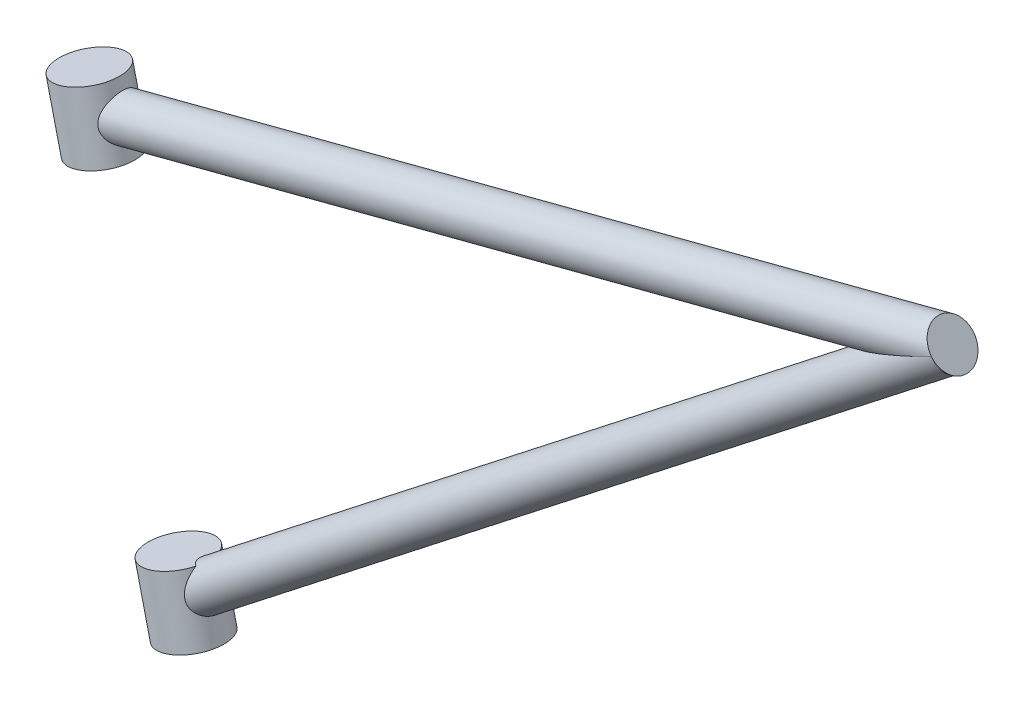
ISO-10303-21;
HEADER;
FILE_DESCRIPTION(('STEP AP214'),'2;1');
FILE_NAME('part.step','',(''),(''),'','','');
FILE_SCHEMA(('AUTOMOTIVE_DESIGN { 1 0 10303 214 1 1 1 1 }'));
ENDSEC;
DATA;
#1=APPLICATION_CONTEXT('core data for automotive mechanical design processes');
#2=APPLICATION_PROTOCOL_DEFINITION('international standard','automotive_design',2000,#1);
#3=PRODUCT_CONTEXT('',#1,'mechanical');
#4=PRODUCT('Part','Part','',(#3));
#5=PRODUCT_RELATED_PRODUCT_CATEGORY('part','',(#4));
#6=PRODUCT_DEFINITION_FORMATION('','',#4);
#7=PRODUCT_DEFINITION_CONTEXT('part definition',#1,'design');
#8=PRODUCT_DEFINITION('design','',#6,#7);
#9=PRODUCT_DEFINITION_SHAPE('','',#8);
#10=(LENGTH_UNIT() NAMED_UNIT(*) SI_UNIT(.MILLI.,.METRE.));
#11=(NAMED_UNIT(*) PLANE_ANGLE_UNIT() SI_UNIT($,.RADIAN.));
#12=(NAMED_UNIT(*) SI_UNIT($,.STERADIAN.) SOLID_ANGLE_UNIT());
#13=UNCERTAINTY_MEASURE_WITH_UNIT(LENGTH_MEASURE(1.E-05),#10,'distance_accuracy_value','');
#14=(GEOMETRIC_REPRESENTATION_CONTEXT(3) GLOBAL_UNCERTAINTY_ASSIGNED_CONTEXT((#13)) GLOBAL_UNIT_ASSIGNED_CONTEXT((#10,
#11,#12)) REPRESENTATION_CONTEXT('',''));
#15=CARTESIAN_POINT('',(0.,0.,0.));
#16=DIRECTION('',(0.,0.,1.));
#17=DIRECTION('',(1.,0.,0.));
#18=AXIS2_PLACEMENT_3D('',#15,#16,#17);
#19=CARTESIAN_POINT('',(215.,1151.6011,-53.649));
#20=DIRECTION('',(0.788508643665139,0.615015858971912,-0.00310033520835739));
#21=DIRECTION('',(-0.615018814783549,0.788512433295911,0.));
#22=AXIS2_PLACEMENT_3D('',#19,#20,#21);
#23=CYLINDRICAL_SURFACE('',#22,9.525);
#24=CARTESIAN_POINT('',(243.39562055654,1173.74893199642,-53.7606486710474));
#25=DIRECTION('',(-0.230684760062267,0.973028498209276,0.000288353283411398));
#26=DIRECTION('',(0.973022198051878,0.230684316193179,-0.00354236655039736));
#27=AXIS2_PLACEMENT_3D('',#24,#25,#26);
#28=ELLIPSE('',#27,22.8674930535986,9.525);
#29=CARTESIAN_POINT('',(224.320634321341,1169.225180437,-48.7995007985226));
#30=VERTEX_POINT('',#29);
#31=CARTESIAN_POINT('',(224.286262085042,1169.21993073521,-58.5827833271125));
#32=VERTEX_POINT('',#31);
#33=EDGE_CURVE('E80',#30,#32,#28,.F.);
#34=ORIENTED_EDGE('',*,*,#33,.F.);
#35=CARTESIAN_POINT('',(224.286262085042,1169.21993073521,-58.5827833271125));
#36=CARTESIAN_POINT('',(224.259857325888,1169.08518369756,-58.7334222265341));
#37=CARTESIAN_POINT('',(224.233039669883,1168.94604086328,-58.8799868131545));
#38=CARTESIAN_POINT('',(224.178991820654,1168.65996638962,-59.1650957687113));
#39=CARTESIAN_POINT('',(224.151761828018,1168.51303845566,-59.3036438886452));
#40=CARTESIAN_POINT('',(224.097330416037,1168.2125631291,-59.5727254876107));
#41=CARTESIAN_POINT('',(224.070129045662,1168.05902930883,-59.7032741781378));
#42=CARTESIAN_POINT('',(224.01607745269,1167.74582344913,-59.9568762347867));
#43=CARTESIAN_POINT('',(223.989227276873,1167.5861506029,-60.0799286101978));
#44=CARTESIAN_POINT('',(223.909708784618,1167.09862159596,-60.4383869338368));
#45=CARTESIAN_POINT('',(223.858116884653,1166.76249561412,-60.6628811966612));
#46=CARTESIAN_POINT('',(223.760795592024,1166.07242209011,-61.0842061784766));
#47=CARTESIAN_POINT('',(223.715069350101,1165.718465111,-61.2810220354276));
#48=CARTESIAN_POINT('',(223.636664786251,1165.0304754153,-61.6302543273577));
#49=CARTESIAN_POINT('',(223.603156724985,1164.69777584187,-61.7851169950369));
#50=CARTESIAN_POINT('',(223.546313161637,1164.02225456936,-62.0730099883752));
#51=CARTESIAN_POINT('',(223.522976398826,1163.67943413039,-62.2060430185345));
#52=CARTESIAN_POINT('',(223.489676812072,1162.9854248798,-62.4497650608225));
#53=CARTESIAN_POINT('',(223.479707198136,1162.63424040913,-62.5604653927971));
#54=CARTESIAN_POINT('',(223.476895189122,1161.92538048244,-62.7582826238399));
#55=CARTESIAN_POINT('',(223.484046705598,1161.56770737875,-62.8454078941737));
#56=CARTESIAN_POINT('',(223.526129800851,1160.72354013421,-63.019632003482));
#57=CARTESIAN_POINT('',(223.569782905443,1160.23511607562,-63.0963815878199));
#58=CARTESIAN_POINT('',(223.673039754559,1159.50421169317,-63.1703509628201));
#59=CARTESIAN_POINT('',(223.713721858204,1159.26100004498,-63.1881497714082));
#60=CARTESIAN_POINT('',(223.808925405596,1158.77656784518,-63.208784261346));
#61=CARTESIAN_POINT('',(223.863446913944,1158.53534730287,-63.21161987285));
#62=CARTESIAN_POINT('',(223.987999226804,1158.0538387664,-63.2009379730411));
#63=CARTESIAN_POINT('',(224.058226605981,1157.81360581606,-63.1872025274816));
#64=CARTESIAN_POINT('',(224.213948087072,1157.33984142985,-63.1417799374408));
#65=CARTESIAN_POINT('',(224.299441506856,1157.10630969509,-63.1100935949197));
#66=CARTESIAN_POINT('',(224.484918597031,1156.64861619958,-63.0279072957908));
#67=CARTESIAN_POINT('',(224.584894816063,1156.4244496964,-62.97741699291));
#68=CARTESIAN_POINT('',(224.797681142944,1155.98766669081,-62.8572366265394));
#69=CARTESIAN_POINT('',(224.910489960448,1155.77504903031,-62.7875484924329));
#70=CARTESIAN_POINT('',(225.128165273432,1155.39502394416,-62.6414190706142));
#71=CARTESIAN_POINT('',(225.231556877416,1155.22571379616,-62.5676942871559));
#72=CARTESIAN_POINT('',(225.44401194002,1154.8971588129,-62.406965429258));
#73=CARTESIAN_POINT('',(225.553077604184,1154.73791794574,-62.319956165241));
#74=CARTESIAN_POINT('',(225.775019094641,1154.42987011107,-62.1331560767408));
#75=CARTESIAN_POINT('',(225.887896113201,1154.28106645417,-62.0333612248764));
#76=CARTESIAN_POINT('',(226.115608918504,1153.99398465869,-61.8215969051118));
#77=CARTESIAN_POINT('',(226.230444940643,1153.85570779608,-61.7096259653097));
#78=CARTESIAN_POINT('',(226.46640898153,1153.58252515966,-61.4679271119184));
#79=CARTESIAN_POINT('',(226.587548762974,1153.44818382824,-61.337573472335));
#80=CARTESIAN_POINT('',(226.82820128942,1153.19075081337,-61.0648374828117));
#81=CARTESIAN_POINT('',(226.947714016948,1153.06765925064,-60.9224550038083));
#82=CARTESIAN_POINT('',(227.183456996661,1152.83235048838,-60.6263657424205));
#83=CARTESIAN_POINT('',(227.29968645648,1152.72013589822,-60.4726562581964));
#84=CARTESIAN_POINT('',(227.527315519424,1152.50626944914,-60.1546736029061));
#85=CARTESIAN_POINT('',(227.63871480492,1152.40461828425,-59.9903997388923));
#86=CARTESIAN_POINT('',(227.873123418797,1152.19569467397,-59.6241829279834));
#87=CARTESIAN_POINT('',(227.995029525822,1152.09024665705,-59.4204877809454));
#88=CARTESIAN_POINT('',(228.228473609432,1151.89287255824,-59.000949780285));
#89=CARTESIAN_POINT('',(228.340010636346,1151.80094771444,-58.7851058168927));
#90=CARTESIAN_POINT('',(228.551008201797,1151.63032006214,-58.3424633826018));
#91=CARTESIAN_POINT('',(228.650465034046,1151.55162130866,-58.1156615794439));
#92=CARTESIAN_POINT('',(228.83572510005,1151.40730238531,-57.6525195071222));
#93=CARTESIAN_POINT('',(228.92152837014,1151.34168218063,-57.416179263345));
#94=CARTESIAN_POINT('',(229.081485830094,1151.22090349209,-56.9251846859305));
#95=CARTESIAN_POINT('',(229.154989456591,1151.16630857725,-56.6701789396034));
#96=CARTESIAN_POINT('',(229.284460401839,1151.07117985988,-56.1531731303483));
#97=CARTESIAN_POINT('',(229.340427068882,1151.0306465799,-55.8911728078801));
#98=CARTESIAN_POINT('',(229.433846047649,1150.963646173,-55.3621714159013));
#99=CARTESIAN_POINT('',(229.471302148862,1150.93717616695,-55.0951713815594));
#100=CARTESIAN_POINT('',(229.527062363931,1150.89830263798,-54.5581687493097));
#101=CARTESIAN_POINT('',(229.545367263428,1150.88589853803,-54.2881662750304));
#102=CARTESIAN_POINT('',(229.562199853024,1150.87535932399,-53.7571259945295));
#103=CARTESIAN_POINT('',(229.561423639708,1150.87672092083,-53.4961198833487));
#104=CARTESIAN_POINT('',(229.54182225614,1150.89250809807,-52.9751874948947));
#105=CARTESIAN_POINT('',(229.522997505866,1150.9069333745,-52.7152611926364));
#106=CARTESIAN_POINT('',(229.467621648065,1150.94883442944,-52.198393218211));
#107=CARTESIAN_POINT('',(229.431072078148,1150.97630907593,-51.9414512891322));
#108=CARTESIAN_POINT('',(229.340854163361,1151.04429691626,-51.4323457186929));
#109=CARTESIAN_POINT('',(229.287185724139,1151.08481018195,-51.1801821036765));
#110=CARTESIAN_POINT('',(229.164114514175,1151.17849155133,-50.684408224491));
#111=CARTESIAN_POINT('',(229.094844818259,1151.23155280478,-50.4407446602848));
#112=CARTESIAN_POINT('',(228.941420982296,1151.35054264559,-49.9613837856289));
#113=CARTESIAN_POINT('',(228.857266934708,1151.41647115302,-49.7256864257047));
#114=CARTESIAN_POINT('',(228.675340927335,1151.56132618532,-49.2636028445119));
#115=CARTESIAN_POINT('',(228.577562843186,1151.64025855868,-49.0372208703685));
#116=CARTESIAN_POINT('',(228.369929673435,1151.81127984121,-48.5952204581985));
#117=CARTESIAN_POINT('',(228.260074308572,1151.90336905461,-48.379602269228));
#118=CARTESIAN_POINT('',(228.025641852722,1152.10472360081,-47.9524464985806));
#119=CARTESIAN_POINT('',(227.900664970458,1152.2145070493,-47.7413721247286));
#120=CARTESIAN_POINT('',(227.641692170489,1152.44898572412,-47.3334870610304));
#121=CARTESIAN_POINT('',(227.507695538429,1152.57368213214,-47.1366775035155));
#122=CARTESIAN_POINT('',(227.233168220124,1152.83848396559,-46.7586981138108));
#123=CARTESIAN_POINT('',(227.092639522964,1152.97858471773,-46.5775235679732));
#124=CARTESIAN_POINT('',(226.807776868606,1153.27482164288,-46.2320765009033));
#125=CARTESIAN_POINT('',(226.663443626362,1153.43095481881,-46.0678008320655));
#126=CARTESIAN_POINT('',(226.398381649131,1153.73220035553,-45.7835229472519));
#127=CARTESIAN_POINT('',(226.277756793015,1153.87476454738,-45.6607174563726));
#128=CARTESIAN_POINT('',(226.038026162807,1154.17157832639,-45.4284949783267));
#129=CARTESIAN_POINT('',(225.918920107725,1154.3258257143,-45.3190754814821));
#130=CARTESIAN_POINT('',(225.68447363856,1154.64583511665,-45.1144618249629));
#131=CARTESIAN_POINT('',(225.56912892202,1154.81158324434,-45.0192509321473));
#132=CARTESIAN_POINT('',(225.344231202539,1155.15444321128,-44.8435327087651));
#133=CARTESIAN_POINT('',(225.234678188904,1155.33155502955,-44.7630253510501));
#134=CARTESIAN_POINT('',(225.022918953883,1155.69734784393,-44.6167956848934));
#135=CARTESIAN_POINT('',(224.920752853279,1155.8860830084,-44.5511505102988));
#136=CARTESIAN_POINT('',(224.726236552822,1156.2731161268,-44.4353515205439));
#137=CARTESIAN_POINT('',(224.633885981681,1156.47141371862,-44.3851971192857));
#138=CARTESIAN_POINT('',(224.460378084522,1156.87601236501,-44.3002130778941));
#139=CARTESIAN_POINT('',(224.379220459273,1157.08231320545,-44.2653830280258));
#140=CARTESIAN_POINT('',(224.228871364813,1157.50114234092,-44.2105340427636));
#141=CARTESIAN_POINT('',(224.159681129355,1157.71367127539,-44.1905166337503));
#142=CARTESIAN_POINT('',(224.024758252432,1158.17268394055,-44.1627261198933));
#143=CARTESIAN_POINT('',(223.960810831434,1158.41981650712,-44.1570163817677));
#144=CARTESIAN_POINT('',(223.84806207577,1158.9173015926,-44.1623562048332));
#145=CARTESIAN_POINT('',(223.799263220286,1159.16765463159,-44.173408507524));
#146=CARTESIAN_POINT('',(223.715527415159,1159.6701047542,-44.2108590866441));
#147=CARTESIAN_POINT('',(223.680624287529,1159.92220459189,-44.2372944252073));
#148=CARTESIAN_POINT('',(223.623333552202,1160.42599160862,-44.3041988677007));
#149=CARTESIAN_POINT('',(223.600950420562,1160.67767860805,-44.3446729823029));
#150=CARTESIAN_POINT('',(223.558780297688,1161.30287687313,-44.4616078378177));
#151=CARTESIAN_POINT('',(223.545694317176,1161.67537289618,-44.5459758038928));
#152=CARTESIAN_POINT('',(223.538808081783,1162.41371197458,-44.7406100397313));
#153=CARTESIAN_POINT('',(223.545016437151,1162.77955198637,-44.8508878516685));
#154=CARTESIAN_POINT('',(223.572366659079,1163.50269049958,-45.0957872402616));
#155=CARTESIAN_POINT('',(223.593520155094,1163.85998212515,-45.230427713817));
#156=CARTESIAN_POINT('',(223.647104845075,1164.56390081036,-45.523302583792));
#157=CARTESIAN_POINT('',(223.679537190931,1164.9105267768,-45.6815393891229));
#158=CARTESIAN_POINT('',(223.756030086726,1165.62330036858,-46.0377397506442));
#159=CARTESIAN_POINT('',(223.800900330001,1165.98819350736,-46.238045206054));
#160=CARTESIAN_POINT('',(223.896881081983,1166.69941202241,-46.6677952406542));
#161=CARTESIAN_POINT('',(223.947988032294,1167.04574782584,-46.897223206772));
#162=CARTESIAN_POINT('',(224.026816912979,1167.5476009186,-47.2640278767862));
#163=CARTESIAN_POINT('',(224.053423020627,1167.7117661915,-47.3899166807251));
#164=CARTESIAN_POINT('',(224.106979674164,1168.03368651719,-47.6495584858503));
#165=CARTESIAN_POINT('',(224.133930170897,1168.19144247162,-47.7833103743365));
#166=CARTESIAN_POINT('',(224.187824471542,1168.5000637803,-48.0591988432474));
#167=CARTESIAN_POINT('',(224.214768147409,1168.65091427743,-48.2013521213038));
#168=CARTESIAN_POINT('',(224.268174197067,1168.94444836238,-48.494074583859));
#169=CARTESIAN_POINT('',(224.294636321789,1169.08712780152,-48.6446479681439));
#170=CARTESIAN_POINT('',(224.320634321341,1169.225180437,-48.7995007985225));
#171=B_SPLINE_CURVE_WITH_KNOTS('',3,(#35,#36,#37,#38,#39,#40,#41,#42,#43,#44,#45,#46,#47,#48,
#49,#50,#51,#52,#53,#54,#55,#56,#57,#58,#59,#60,#61,#62,#63,#64,#65,#66,#67,#68,#69,#70,#71,#72,
#73,#74,#75,#76,#77,#78,#79,#80,#81,#82,#83,#84,#85,#86,#87,#88,#89,#90,#91,#92,#93,#94,#95,#96,
#97,#98,#99,#100,#101,#102,#103,#104,#105,#106,#107,#108,#109,#110,#111,#112,#113,#114,#115,
#116,#117,#118,#119,#120,#121,#122,#123,#124,#125,#126,#127,#128,#129,#130,#131,#132,#133,#134,
#135,#136,#137,#138,#139,#140,#141,#142,#143,#144,#145,#146,#147,#148,#149,#150,#151,#152,#153,
#154,#155,#156,#157,#158,#159,#160,#161,#162,#163,#164,#165,#166,#167,#168,#169,#170),
.UNSPECIFIED.,.F.,.F.,(4,2,2,2,2,2,2,2,2,2,2,2,2,2,2,2,2,2,2,2,2,2,2,2,2,2,2,2,2,2,2,2,2,2,2,2,
2,2,2,2,2,2,2,2,2,2,2,2,2,2,2,2,2,2,2,2,2,2,2,2,2,2,2,2,2,2,2,4),(0.,0.611321113095535,
1.22235382943916,1.83218605530848,2.44209870234858,3.66289333627033,4.88434099855862,
5.98894252437597,7.09340709627896,8.19731043031264,9.30082126350922,10.7844934193151,
11.5255072719035,12.2665245834173,13.0173945439189,13.7682309617921,14.5186824394657,
15.2690585242179,15.9032452299519,16.5376803173909,17.172315741574,17.8070279688859,
18.4752867183988,19.1435526389087,19.8119784806391,20.48044821112,21.2588433186672,
22.0373096468024,22.8160142137429,23.5947167082835,24.4065344178049,25.2183822925518,
26.030063896594,26.8417122016533,27.6237962912566,28.4058621827752,29.1878602430734,
29.9698626134922,30.7454316380738,31.5209958450605,32.296909820138,33.0728417402577,
33.8781372588609,34.6834966314204,35.4886123495505,36.2935778332748,36.963445893815,
37.6331881707954,38.3021353757178,38.971081345498,39.6434233396011,40.3157398923394,
40.9880384679269,41.6604063114264,42.4252747618274,43.19026832305,43.9571126486434,
44.7242309558053,45.8689446439783,47.0141692429464,48.1602859732016,49.3065197888626,
50.561168015951,51.8151037127786,52.4406454213909,53.0660988220636,53.6928400783572,
54.3198967787742),.UNSPECIFIED.);
#172=EDGE_CURVE('E86',#32,#30,#171,.T.);
#173=ORIENTED_EDGE('',*,*,#172,.F.);
#174=EDGE_LOOP('',(#34,#173));
#175=FACE_BOUND('',#174,.T.);
#176=CARTESIAN_POINT('',(558.599999999999,1419.6,-55.));
#177=DIRECTION('',(0.897008226583714,0.442000857679935,-0.00338869463695132));
#178=DIRECTION('',(-0.441999884452041,0.897014466927656,0.00107157215105032));
#179=AXIS2_PLACEMENT_3D('',#176,#177,#178);
#180=ELLIPSE('',#179,9.72785711197768,9.525);
#181=CARTESIAN_POINT('',(558.633464600869,1419.60511105407,-45.4750601577955));
#182=VERTEX_POINT('',#181);
#183=CARTESIAN_POINT('',(558.566535399132,1419.59488894593,-64.5249398422045));
#184=VERTEX_POINT('',#183);
#185=EDGE_CURVE('E93',#182,#184,#180,.T.);
#186=ORIENTED_EDGE('',*,*,#185,.F.);
#187=CARTESIAN_POINT('',(558.599999999999,1419.6,-55.));
#188=DIRECTION('',(-0.441999884452041,0.897014466927656,0.00107157215105032));
#189=DIRECTION('',(0.897008226583714,0.442000857679935,-0.00338869463695132));
#190=AXIS2_PLACEMENT_3D('',#187,#188,#189);
#191=ELLIPSE('',#190,46.8855974220386,9.525);
#192=EDGE_CURVE('E119',#184,#182,#191,.T.);
#193=ORIENTED_EDGE('',*,*,#192,.F.);
#194=EDGE_LOOP('',(#186,#193));
#195=FACE_BOUND('',#194,.T.);
#196=ADVANCED_FACE('F67',(#175,#195),#23,.T.);
#197=CARTESIAN_POINT('',(175.,1320.3211,-53.599));
#198=DIRECTION('',(0.968096795715719,0.250551577091192,-0.00353572369863849));
#199=DIRECTION('',(-0.250553143221362,0.968102847027058,0.));
#200=AXIS2_PLACEMENT_3D('',#197,#198,#199);
#201=CYLINDRICAL_SURFACE('',#200,9.525);
#202=CARTESIAN_POINT('',(186.358449875382,1333.09959285992,-53.6491999503622));
#203=CARTESIAN_POINT('',(186.357581805738,1333.09936924817,-53.8860568586097));
#204=CARTESIAN_POINT('',(186.352921387654,1333.08902414914,-54.1228779562829));
#205=CARTESIAN_POINT('',(186.336141928165,1333.04828094335,-54.5945068523737));
#206=CARTESIAN_POINT('',(186.324023352325,1333.01788408828,-54.8293147755331));
#207=CARTESIAN_POINT('',(186.292666114835,1332.93755309473,-55.2951172089378));
#208=CARTESIAN_POINT('',(186.273425955695,1332.88761484706,-55.526110906468));
#209=CARTESIAN_POINT('',(186.228361236772,1332.76901114286,-55.9825714129173));
#210=CARTESIAN_POINT('',(186.202536484875,1332.70034513992,-56.2080380603657));
#211=CARTESIAN_POINT('',(186.145145325905,1332.54570964981,-56.6508525754505));
#212=CARTESIAN_POINT('',(186.113609333163,1332.45983157607,-56.8682364289368));
#213=CARTESIAN_POINT('',(186.045493710991,1332.27164581024,-57.2950339080024));
#214=CARTESIAN_POINT('',(186.00891210623,1332.16933168093,-57.5044443708686));
#215=CARTESIAN_POINT('',(185.931611677371,1331.94951339829,-57.9142212421292));
#216=CARTESIAN_POINT('',(185.890894265745,1331.83201442722,-58.1145907046935));
#217=CARTESIAN_POINT('',(185.806239384516,1331.58291939138,-58.5057339536995));
#218=CARTESIAN_POINT('',(185.762300721704,1331.45131809444,-58.6965041398218));
#219=CARTESIAN_POINT('',(185.668207883311,1331.16291156617,-59.0843166682633));
#220=CARTESIAN_POINT('',(185.617847978309,1331.00490627344,-59.2804163396614));
#221=CARTESIAN_POINT('',(185.515822385934,1330.67483630273,-59.6600487913169));
#222=CARTESIAN_POINT('',(185.464156548356,1330.50277000237,-59.8435801169037));
#223=CARTESIAN_POINT('',(185.360844773911,1330.14549946665,-60.197931970596));
#224=CARTESIAN_POINT('',(185.309198975563,1329.96027646621,-60.3687336016283));
#225=CARTESIAN_POINT('',(185.207513427391,1329.57802118981,-60.6969344393526));
#226=CARTESIAN_POINT('',(185.157473194482,1329.38099251812,-60.8543377013953));
#227=CARTESIAN_POINT('',(185.052074145416,1328.94040065302,-61.1819144564466));
#228=CARTESIAN_POINT('',(184.997324603338,1328.69474183357,-61.3494760918669));
#229=CARTESIAN_POINT('',(184.895124717704,1328.18960759521,-61.6650101261469));
#230=CARTESIAN_POINT('',(184.847676144492,1327.93012884571,-61.8129777726354));
#231=CARTESIAN_POINT('',(184.763424911842,1327.39915978738,-62.0881314357339));
#232=CARTESIAN_POINT('',(184.726607184471,1327.12768711447,-62.2153467537986));
#233=CARTESIAN_POINT('',(184.667181423721,1326.57392268385,-62.4479771640655));
#234=CARTESIAN_POINT('',(184.64457385024,1326.29163057629,-62.5533915506263));
#235=CARTESIAN_POINT('',(184.621485123181,1325.80286250974,-62.7131545304106));
#236=CARTESIAN_POINT('',(184.616451088553,1325.59851542322,-62.7734026114947));
#237=CARTESIAN_POINT('',(184.616781271352,1325.18667623677,-62.88151769934));
#238=CARTESIAN_POINT('',(184.622138831213,1324.9791862349,-62.9293926109313));
#239=CARTESIAN_POINT('',(184.644451588589,1324.56250380516,-63.0120817315778));
#240=CARTESIAN_POINT('',(184.661391083203,1324.35331406078,-63.0469135257822));
#241=CARTESIAN_POINT('',(184.707787702243,1323.93447859591,-63.1030109629274));
#242=CARTESIAN_POINT('',(184.737244818194,1323.72483287572,-63.1242766150539));
#243=CARTESIAN_POINT('',(184.809376765781,1323.30562257425,-63.1528835624823));
#244=CARTESIAN_POINT('',(184.852125615775,1323.09606519691,-63.1601452000057));
#245=CARTESIAN_POINT('',(184.950720167319,1322.68004735338,-63.1603045370767));
#246=CARTESIAN_POINT('',(185.006565827107,1322.47358687733,-63.153202282425));
#247=CARTESIAN_POINT('',(185.130725059478,1322.06534813991,-63.124715285959));
#248=CARTESIAN_POINT('',(185.1990452174,1321.86357241537,-63.1033229844382));
#249=CARTESIAN_POINT('',(185.346956732024,1321.46622562205,-63.0466041357607));
#250=CARTESIAN_POINT('',(185.426548259071,1321.27065464711,-63.0112773779979));
#251=CARTESIAN_POINT('',(185.589795585038,1320.89964521409,-62.9300597690826));
#252=CARTESIAN_POINT('',(185.672819955293,1320.72373655515,-62.8850372001994));
#253=CARTESIAN_POINT('',(185.845969463324,1320.37871903053,-62.7838642623975));
#254=CARTESIAN_POINT('',(185.93609722828,1320.20961271594,-62.7277097646059));
#255=CARTESIAN_POINT('',(186.215068504544,1319.71289126492,-62.54329813677));
#256=CARTESIAN_POINT('',(186.412512692632,1319.39584564143,-62.3990866125953));
#257=CARTESIAN_POINT('',(186.765826290244,1318.87052979932,-62.1152121318951));
#258=CARTESIAN_POINT('',(186.919011236763,1318.65554568582,-61.9842838873622));
#259=CARTESIAN_POINT('',(187.228263744508,1318.24098753079,-61.7026174616929));
#260=CARTESIAN_POINT('',(187.384332336723,1318.04141913833,-61.5518720727678));
#261=CARTESIAN_POINT('',(187.696163578207,1317.65729232131,-61.2313067808288));
#262=CARTESIAN_POINT('',(187.851925349499,1317.47275820803,-61.061457000686));
#263=CARTESIAN_POINT('',(188.15984241871,1317.1189504319,-60.7036160437416));
#264=CARTESIAN_POINT('',(188.311998122509,1316.94967504553,-60.5156269208007));
#265=CARTESIAN_POINT('',(188.611258175865,1316.62499302276,-60.1202846008485));
#266=CARTESIAN_POINT('',(188.758302080137,1316.46973067059,-59.9127669583086));
#267=CARTESIAN_POINT('',(189.043006391365,1316.17528054179,-59.4805307218162));
#268=CARTESIAN_POINT('',(189.180666052356,1316.03609404243,-59.2558107634381));
#269=CARTESIAN_POINT('',(189.443583326935,1315.77472067425,-58.7903989265441));
#270=CARTESIAN_POINT('',(189.56886071874,1315.65250656462,-58.5497335795888));
#271=CARTESIAN_POINT('',(189.804496573069,1315.42576218832,-58.0532590524574));
#272=CARTESIAN_POINT('',(189.914858982971,1315.32122724086,-57.7974539050311));
#273=CARTESIAN_POINT('',(190.097360437763,1315.1502664167,-57.3256531481095));
#274=CARTESIAN_POINT('',(190.172709407114,1315.08041316403,-57.1121321695133));
#275=CARTESIAN_POINT('',(190.310988394956,1314.9531980356,-56.6774962166102));
#276=CARTESIAN_POINT('',(190.373920711047,1314.89583384865,-56.4563826561554));
#277=CARTESIAN_POINT('',(190.486204383596,1314.79417399333,-56.0078915180193));
#278=CARTESIAN_POINT('',(190.535561910641,1314.74987238654,-55.7805168382876));
#279=CARTESIAN_POINT('',(190.619775648931,1314.67479620972,-55.3208802448295));
#280=CARTESIAN_POINT('',(190.654631569934,1314.64402191043,-55.088618233383));
#281=CARTESIAN_POINT('',(190.709219506578,1314.59629971111,-54.620094518065));
#282=CARTESIAN_POINT('',(190.728899436158,1314.57939941584,-54.3838218589998));
#283=CARTESIAN_POINT('',(190.752522070303,1314.55982499237,-53.9098999993929));
#284=CARTESIAN_POINT('',(190.756464777017,1314.55715086223,-53.6722507990392));
#285=CARTESIAN_POINT('',(190.74853796159,1314.56606538467,-53.1974797402003));
#286=CARTESIAN_POINT('',(190.736667952536,1314.57765447645,-52.9603578981791));
#287=CARTESIAN_POINT('',(190.697385799487,1314.61494272464,-52.4885342998953));
#288=CARTESIAN_POINT('',(190.669974064182,1314.64064151002,-52.2538324801602));
#289=CARTESIAN_POINT('',(190.60210702458,1314.70404480997,-51.8012890673313));
#290=CARTESIAN_POINT('',(190.562442949291,1314.74101966432,-51.5832251363854));
#291=CARTESIAN_POINT('',(190.470468361588,1314.82691729862,-51.1521053557148));
#292=CARTESIAN_POINT('',(190.418153471505,1314.87584421449,-50.9390512676522));
#293=CARTESIAN_POINT('',(190.301804769865,1314.98516246825,-50.5192623113846));
#294=CARTESIAN_POINT('',(190.23777433869,1315.04555049935,-50.3125256403926));
#295=CARTESIAN_POINT('',(190.098988703125,1315.17732773214,-49.9062127733766));
#296=CARTESIAN_POINT('',(190.024229563262,1315.24872097144,-49.7066392386435));
#297=CARTESIAN_POINT('',(189.859092695624,1315.40779858859,-49.3007311374482));
#298=CARTESIAN_POINT('',(189.767961451142,1315.49630657265,-49.0950262173476));
#299=CARTESIAN_POINT('',(189.575995491525,1315.68492732757,-48.6936144814056));
#300=CARTESIAN_POINT('',(189.475156675702,1315.78504500631,-48.4979119446988));
#301=CARTESIAN_POINT('',(189.26523354595,1315.99640745987,-48.1171153382557));
#302=CARTESIAN_POINT('',(189.156145774544,1316.10765690685,-47.9320257746452));
#303=CARTESIAN_POINT('',(188.931243948177,1316.34086214408,-47.5730060039958));
#304=CARTESIAN_POINT('',(188.815429173267,1316.462819081,-47.3990769956121));
#305=CARTESIAN_POINT('',(188.559595552326,1316.73754646288,-47.0358277650413));
#306=CARTESIAN_POINT('',(188.418671770066,1316.89212314421,-46.8485064696081));
#307=CARTESIAN_POINT('',(188.13219334881,1317.21509488208,-46.4899780943311));
#308=CARTESIAN_POINT('',(187.98663799616,1317.38349207451,-46.3187735140675));
#309=CARTESIAN_POINT('',(187.69335940703,1317.73417382321,-45.993015875013));
#310=CARTESIAN_POINT('',(187.545635360469,1317.9164636812,-45.8384692281109));
#311=CARTESIAN_POINT('',(187.250896297353,1318.29489878848,-45.546893630638));
#312=CARTESIAN_POINT('',(187.10388116203,1318.49104162417,-45.4098616401601));
#313=CARTESIAN_POINT('',(186.711848019207,1319.03983337127,-45.0646876401787));
#314=CARTESIAN_POINT('',(186.470069582025,1319.40614092922,-44.8736949049768));
#315=CARTESIAN_POINT('',(186.128594725721,1319.98579136724,-44.6318338491623));
#316=CARTESIAN_POINT('',(186.0183486621,1320.18393967721,-44.5586753759218));
#317=CARTESIAN_POINT('',(185.807142470588,1320.59017598142,-44.428001535468));
#318=CARTESIAN_POINT('',(185.706180581936,1320.79826207953,-44.3704831980091));
#319=CARTESIAN_POINT('',(185.530685811562,1321.19053640945,-44.2796599099045));
#320=CARTESIAN_POINT('',(185.454481769683,1321.37343182466,-44.2439841214191));
#321=CARTESIAN_POINT('',(185.311718069508,1321.74487735506,-44.1849503604514));
#322=CARTESIAN_POINT('',(185.245156582567,1321.93342638987,-44.1615900502011));
#323=CARTESIAN_POINT('',(185.12276253222,1322.31497282549,-44.1275367958688));
#324=CARTESIAN_POINT('',(185.066923258771,1322.507967359,-44.11683590764));
#325=CARTESIAN_POINT('',(184.966599723133,1322.89717359928,-44.1082177379753));
#326=CARTESIAN_POINT('',(184.92211571741,1323.09338537861,-44.1103007452468));
#327=CARTESIAN_POINT('',(184.844776252853,1323.48730711267,-44.1271574854349));
#328=CARTESIAN_POINT('',(184.811907648939,1323.68501511354,-44.1419168073075));
#329=CARTESIAN_POINT('',(184.757495126135,1324.08065900116,-44.1838093238672));
#330=CARTESIAN_POINT('',(184.735951123118,1324.27859488622,-44.2109424266309));
#331=CARTESIAN_POINT('',(184.70354236532,1324.67351258009,-44.2771572319573));
#332=CARTESIAN_POINT('',(184.692687677242,1324.87049331603,-44.3162501524127));
#333=CARTESIAN_POINT('',(184.68076744278,1325.26222490871,-44.4058469426852));
#334=CARTESIAN_POINT('',(184.679707454993,1325.45697443661,-44.4563572753527));
#335=CARTESIAN_POINT('',(184.687432459972,1325.90937755942,-44.5873846734801));
#336=CARTESIAN_POINT('',(184.699715432589,1326.16571891247,-44.6722531138744));
#337=CARTESIAN_POINT('',(184.737184333095,1326.67067267163,-44.8602330441933));
#338=CARTESIAN_POINT('',(184.762375216181,1326.91928207063,-44.9633515301394));
#339=CARTESIAN_POINT('',(184.822955696175,1327.40770496011,-45.1868747568261));
#340=CARTESIAN_POINT('',(184.858359441897,1327.64750572402,-45.3073033619292));
#341=CARTESIAN_POINT('',(184.936812023289,1328.11684032839,-45.564459999739));
#342=CARTESIAN_POINT('',(184.979860231173,1328.34637501001,-45.701186693695));
#343=CARTESIAN_POINT('',(185.072300087104,1328.79902176096,-45.9933844218682));
#344=CARTESIAN_POINT('',(185.121807668162,1329.02189163759,-46.1491936767173));
#345=CARTESIAN_POINT('',(185.22424037892,1329.45488860031,-46.4766106031539));
#346=CARTESIAN_POINT('',(185.277165647241,1329.66501516887,-46.6482189156703));
#347=CARTESIAN_POINT('',(185.384406200937,1330.07117091901,-47.0066185949464));
#348=CARTESIAN_POINT('',(185.438720168277,1330.26721284094,-47.1933959061554));
#349=CARTESIAN_POINT('',(185.546984847139,1330.64416011972,-47.5819021627384));
#350=CARTESIAN_POINT('',(185.600935430507,1330.82506036979,-47.7836361095697));
#351=CARTESIAN_POINT('',(185.703609981598,1331.15991960414,-48.1890961845373));
#352=CARTESIAN_POINT('',(185.752454295458,1331.31483948368,-48.391997545968));
#353=CARTESIAN_POINT('',(185.84691275443,1331.60840694889,-48.8098351485464));
#354=CARTESIAN_POINT('',(185.8925285236,1331.74706273932,-49.0247652400169));
#355=CARTESIAN_POINT('',(185.979264145823,1332.00667430089,-49.4659537140339));
#356=CARTESIAN_POINT('',(186.020384057609,1332.12763030326,-49.6922119485354));
#357=CARTESIAN_POINT('',(186.096912393674,1332.35026974381,-50.1549758014051));
#358=CARTESIAN_POINT('',(186.132320921415,1332.45195353111,-50.3914812340472));
#359=CARTESIAN_POINT('',(186.19609848046,1332.63387559637,-50.8716561480927));
#360=CARTESIAN_POINT('',(186.22451430816,1332.71425673083,-51.1152650812674));
#361=CARTESIAN_POINT('',(186.273687588887,1332.85311224309,-51.6094271370383));
#362=CARTESIAN_POINT('',(186.294445112961,1332.91158682411,-51.8599801951905));
#363=CARTESIAN_POINT('',(186.327567958921,1333.00548903654,-52.3657615985444));
#364=CARTESIAN_POINT('',(186.339938743977,1333.04093167046,-52.620986788781));
#365=CARTESIAN_POINT('',(186.355851439896,1333.08810419856,-53.1338888977806));
#366=CARTESIAN_POINT('',(186.359394093362,1333.09983608721,-53.3915656084966));
#367=CARTESIAN_POINT('',(186.358449875382,1333.09959285992,-53.6491999503622));
#368=B_SPLINE_CURVE_WITH_KNOTS('',3,(#202,#203,#204,#205,#206,#207,#208,#209,#210,#211,#212,
#213,#214,#215,#216,#217,#218,#219,#220,#221,#222,#223,#224,#225,#226,#227,#228,#229,#230,#231,
#232,#233,#234,#235,#236,#237,#238,#239,#240,#241,#242,#243,#244,#245,#246,#247,#248,#249,#250,
#251,#252,#253,#254,#255,#256,#257,#258,#259,#260,#261,#262,#263,#264,#265,#266,#267,#268,#269,
#270,#271,#272,#273,#274,#275,#276,#277,#278,#279,#280,#281,#282,#283,#284,#285,#286,#287,#288,
#289,#290,#291,#292,#293,#294,#295,#296,#297,#298,#299,#300,#301,#302,#303,#304,#305,#306,#307,
#308,#309,#310,#311,#312,#313,#314,#315,#316,#317,#318,#319,#320,#321,#322,#323,#324,#325,#326,
#327,#328,#329,#330,#331,#332,#333,#334,#335,#336,#337,#338,#339,#340,#341,#342,#343,#344,#345,
#346,#347,#348,#349,#350,#351,#352,#353,#354,#355,#356,#357,#358,#359,#360,#361,#362,#363,#364,
#365,#366,#367),.UNSPECIFIED.,.T.,.F.,(4,2,2,2,2,2,2,2,2,2,2,2,2,2,2,2,2,2,2,2,2,2,2,2,2,2,2,2,
2,2,2,2,2,2,2,2,2,2,2,2,2,2,2,2,2,2,2,2,2,2,2,2,2,2,2,2,2,2,2,2,2,2,2,2,2,2,2,2,2,2,2,2,2,2,2,2,
2,2,2,2,2,2,4),(0.,0.710310532065492,1.42057672855423,2.13099236113728,2.84142872358443,
3.5481874354624,4.25522362907283,4.96201916039265,5.66907783724382,6.43880362490134,
7.20861835119722,7.97955399035221,8.75025545066418,9.65630521078588,10.5625743253641,
11.467552536204,12.3725600343403,13.0113085736469,13.6496480221224,14.2871237154373,
14.924598977121,15.5656897589392,16.2067784965753,16.8482066512131,17.489644500793,
18.0880261108857,18.6866300795514,19.8837448008437,20.766757648491,21.6500925541691,
22.5348286253754,23.4194646379888,24.3123622815724,25.2053308201038,26.0968491514646,
26.9881310708987,27.6982812613551,28.4082999208326,29.1179952971405,29.827704877021,
30.5398395669877,31.2519741597256,31.964130681342,32.6762684766829,33.3496420855111,
34.0232490418869,34.6966619425942,35.3703224970922,36.0949159830459,36.8198169073012,
37.5450233697629,38.2703075902344,39.1117981320394,39.9534189683606,40.7953626089414,
41.6371599197263,43.066682546431,43.7807742086203,44.4947301615389,45.09806308502,
45.7012814404205,46.3041210580419,46.9069742900515,47.509143075325,48.1113073872364,
48.7140382490255,49.3171111460853,50.12683525087,50.9368704324654,51.748033264266,
52.5591295117293,53.3875647966806,54.2160337040368,55.0437435262465,55.8717313916595,
56.6507079843022,57.429289900706,58.2078616446578,58.9864192832424,59.7596156087014,
60.5328047610201,61.3054897682176,62.0781097766562),.UNSPECIFIED.);
#369=CARTESIAN_POINT('',(186.358449875382,1333.09959285992,-53.6491999503622));
#370=VERTEX_POINT('',#369);
#371=EDGE_CURVE('E12',#370,#370,#368,.T.);
#372=ORIENTED_EDGE('',*,*,#371,.F.);
#373=EDGE_LOOP('',(#372));
#374=FACE_BOUND('',#373,.T.);
#375=CARTESIAN_POINT('',(558.600000000001,1419.6,-55.));
#376=DIRECTION('',(0.788508643665139,0.615015858971912,-0.00310033520835738));
#377=DIRECTION('',(0.615013638287672,-0.788514556162628,-0.00173765353659148));
#378=AXIS2_PLACEMENT_3D('',#375,#376,#377);
#379=ELLIPSE('',#378,10.38195969076,9.525);
#380=EDGE_CURVE('E112',#182,#184,#379,.F.);
#381=ORIENTED_EDGE('',*,*,#380,.T.);
#382=ORIENTED_EDGE('',*,*,#192,.T.);
#383=EDGE_LOOP('',(#381,#382));
#384=FACE_BOUND('',#383,.T.);
#385=ADVANCED_FACE('F139',(#374,#384),#201,.T.);
#386=EDGE_CURVE('E108',#184,#182,#379,.F.);
#387=ORIENTED_EDGE('',*,*,#386,.T.);
#388=ORIENTED_EDGE('',*,*,#185,.T.);
#389=EDGE_LOOP('',(#387,#388));
#390=FACE_BOUND('',#389,.T.);
#391=ADVANCED_FACE('F142',(#390),#201,.T.);
#392=CARTESIAN_POINT('',(558.6,1419.6,-55.));
#393=DIRECTION('',(0.788508643665139,0.615015858971912,-0.00310033520835738));
#394=DIRECTION('',(-0.615018814783548,0.788512433295912,0.));
#395=AXIS2_PLACEMENT_3D('',#392,#393,#394);
#396=PLANE('',#395);
#397=ORIENTED_EDGE('',*,*,#380,.F.);
#398=ORIENTED_EDGE('',*,*,#386,.F.);
#399=EDGE_LOOP('',(#397,#398));
#400=FACE_BOUND('',#399,.T.);
#401=ADVANCED_FACE('F69',(#400),#396,.T.);
#402=CARTESIAN_POINT('',(218.460272,1137.00567,-53.6533253));
#403=DIRECTION('',(-0.230684760062267,0.973028498209276,0.000288353283411398));
#404=DIRECTION('',(-0.973028538661778,-0.230684769652712,0.));
#405=AXIS2_PLACEMENT_3D('',#402,#403,#404);
#406=PLANE('',#405);
#407=CARTESIAN_POINT('',(218.460272,1137.00567,-53.6533253));
#408=DIRECTION('',(-0.230684760062267,0.973028498209276,0.000288353283411398));
#409=DIRECTION('',(-0.973028538661778,-0.230684769652712,0.));
#410=AXIS2_PLACEMENT_3D('',#407,#408,#409);
#411=CIRCLE('',#410,14.);
#412=CARTESIAN_POINT('',(204.837872458735,1133.77608322486,-53.6533253));
#413=VERTEX_POINT('',#412);
#414=EDGE_CURVE('E109',#413,#413,#411,.T.);
#415=ORIENTED_EDGE('',*,*,#414,.F.);
#416=EDGE_LOOP('',(#415));
#417=FACE_BOUND('',#416,.T.);
#418=ADVANCED_FACE('F135',(#417),#406,.F.);
#419=CARTESIAN_POINT('',(211.539728,1166.19653,-53.6446747));
#420=DIRECTION('',(-0.230684760062267,0.973028498209276,0.000288353283411398));
#421=DIRECTION('',(-0.973028538661778,-0.230684769652712,0.));
#422=AXIS2_PLACEMENT_3D('',#419,#420,#421);
#423=PLANE('',#422);
#424=CARTESIAN_POINT('',(211.539728,1166.19653,-53.6446747));
#425=DIRECTION('',(-0.230684760062267,0.973028498209276,0.000288353283411398));
#426=DIRECTION('',(-0.973028538661778,-0.230684769652712,0.));
#427=AXIS2_PLACEMENT_3D('',#424,#425,#426);
#428=CIRCLE('',#427,14.);
#429=EDGE_CURVE('E105',#32,#30,#428,.T.);
#430=ORIENTED_EDGE('',*,*,#429,.T.);
#431=ORIENTED_EDGE('',*,*,#33,.T.);
#432=EDGE_LOOP('',(#430,#431));
#433=FACE_BOUND('',#432,.T.);
#434=ADVANCED_FACE('F107',(#433),#423,.T.);
#435=CARTESIAN_POINT('',(218.460272,1137.00567,-53.6533253));
#436=DIRECTION('',(-0.230684760062267,0.973028498209276,0.000288353283411629));
#437=DIRECTION('',(-0.973028538661778,-0.230684769652712,0.));
#438=AXIS2_PLACEMENT_3D('',#435,#436,#437);
#439=CYLINDRICAL_SURFACE('',#438,14.);
#440=ORIENTED_EDGE('',*,*,#429,.F.);
#441=ORIENTED_EDGE('',*,*,#172,.T.);
#442=EDGE_LOOP('',(#440,#441));
#443=FACE_BOUND('',#442,.T.);
#444=ORIENTED_EDGE('',*,*,#414,.T.);
#445=EDGE_LOOP('',(#444));
#446=FACE_BOUND('',#445,.T.);
#447=ADVANCED_FACE('F103',(#443,#446),#439,.T.);
#448=CARTESIAN_POINT('',(178.460272,1305.72567,-53.6033253));
#449=DIRECTION('',(-0.230684760062262,0.973028498209277,0.000288353283412779));
#450=DIRECTION('',(-0.973028538661779,-0.230684769652707,0.));
#451=AXIS2_PLACEMENT_3D('',#448,#449,#450);
#452=PLANE('',#451);
#453=CARTESIAN_POINT('',(178.460272,1305.72567,-53.6033253));
#454=DIRECTION('',(-0.230684760062262,0.973028498209277,0.000288353283412779));
#455=DIRECTION('',(-0.973028538661779,-0.230684769652707,0.));
#456=AXIS2_PLACEMENT_3D('',#453,#454,#455);
#457=CIRCLE('',#456,14.);
#458=CARTESIAN_POINT('',(164.837872458735,1302.49608322486,-53.6033253));
#459=VERTEX_POINT('',#458);
#460=EDGE_CURVE('E270',#459,#459,#457,.T.);
#461=ORIENTED_EDGE('',*,*,#460,.F.);
#462=EDGE_LOOP('',(#461));
#463=FACE_BOUND('',#462,.T.);
#464=ADVANCED_FACE('F131',(#463),#452,.F.);
#465=CARTESIAN_POINT('',(171.539728,1334.91653,-53.5946747));
#466=DIRECTION('',(-0.230684760062262,0.973028498209277,0.000288353283412779));
#467=DIRECTION('',(-0.973028538661779,-0.230684769652707,0.));
#468=AXIS2_PLACEMENT_3D('',#465,#466,#467);
#469=PLANE('',#468);
#470=CARTESIAN_POINT('',(171.539728,1334.91653,-53.5946747));
#471=DIRECTION('',(-0.230684760062262,0.973028498209277,0.000288353283412779));
#472=DIRECTION('',(-0.973028538661779,-0.230684769652707,0.));
#473=AXIS2_PLACEMENT_3D('',#470,#471,#472);
#474=CIRCLE('',#473,14.);
#475=CARTESIAN_POINT('',(157.917328458735,1331.68694322486,-53.5946747));
#476=VERTEX_POINT('',#475);
#477=EDGE_CURVE('E115',#476,#476,#474,.T.);
#478=ORIENTED_EDGE('',*,*,#477,.T.);
#479=EDGE_LOOP('',(#478));
#480=FACE_BOUND('',#479,.T.);
#481=ADVANCED_FACE('F177',(#480),#469,.T.);
#482=CARTESIAN_POINT('',(178.460272,1305.72567,-53.6033253));
#483=DIRECTION('',(-0.230684760062265,0.973028498209276,0.000288353283411627));
#484=DIRECTION('',(-0.973028538661778,-0.23068476965271,0.));
#485=AXIS2_PLACEMENT_3D('',#482,#483,#484);
#486=CYLINDRICAL_SURFACE('',#485,14.);
#487=ORIENTED_EDGE('',*,*,#371,.T.);
#488=EDGE_LOOP('',(#487));
#489=FACE_BOUND('',#488,.T.);
#490=ORIENTED_EDGE('',*,*,#477,.F.);
#491=EDGE_LOOP('',(#490));
#492=FACE_BOUND('',#491,.T.);
#493=ORIENTED_EDGE('',*,*,#460,.T.);
#494=EDGE_LOOP('',(#493));
#495=FACE_BOUND('',#494,.T.);
#496=ADVANCED_FACE('F138',(#489,#492,#495),#486,.T.);
#497=CLOSED_SHELL('',(#196,#385,#391,#401,#418,#434,#447,#464,#481,#496));
#498=MANIFOLD_SOLID_BREP('B2',#497);
#499=ADVANCED_BREP_SHAPE_REPRESENTATION('',(#18,#498),#14);
#500=SHAPE_DEFINITION_REPRESENTATION(#9,#499);
ENDSEC;
END-ISO-10303-21;
